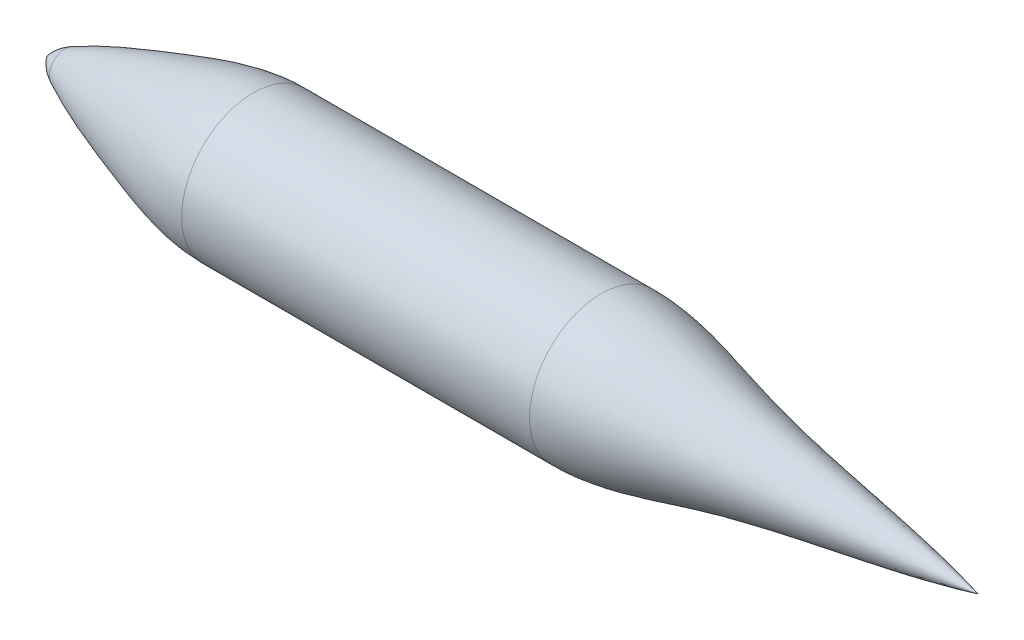
ISO-10303-21;
HEADER;
FILE_DESCRIPTION(('STEP AP214'),'2;1');
FILE_NAME('part.step','',(''),(''),'','','');
FILE_SCHEMA(('AUTOMOTIVE_DESIGN { 1 0 10303 214 1 1 1 1 }'));
ENDSEC;
DATA;
#1=APPLICATION_CONTEXT('core data for automotive mechanical design processes');
#2=APPLICATION_PROTOCOL_DEFINITION('international standard','automotive_design',2000,#1);
#3=PRODUCT_CONTEXT('',#1,'mechanical');
#4=PRODUCT('Part','Part','',(#3));
#5=PRODUCT_RELATED_PRODUCT_CATEGORY('part','',(#4));
#6=PRODUCT_DEFINITION_FORMATION('','',#4);
#7=PRODUCT_DEFINITION_CONTEXT('part definition',#1,'design');
#8=PRODUCT_DEFINITION('design','',#6,#7);
#9=PRODUCT_DEFINITION_SHAPE('','',#8);
#10=(LENGTH_UNIT() NAMED_UNIT(*) SI_UNIT(.MILLI.,.METRE.));
#11=(NAMED_UNIT(*) PLANE_ANGLE_UNIT() SI_UNIT($,.RADIAN.));
#12=(NAMED_UNIT(*) SI_UNIT($,.STERADIAN.) SOLID_ANGLE_UNIT());
#13=UNCERTAINTY_MEASURE_WITH_UNIT(LENGTH_MEASURE(1.E-05),#10,'distance_accuracy_value','');
#14=(GEOMETRIC_REPRESENTATION_CONTEXT(3) GLOBAL_UNCERTAINTY_ASSIGNED_CONTEXT((#13)) GLOBAL_UNIT_ASSIGNED_CONTEXT((#10,
#11,#12)) REPRESENTATION_CONTEXT('',''));
#15=CARTESIAN_POINT('',(0.,0.,0.));
#16=DIRECTION('',(0.,0.,1.));
#17=DIRECTION('',(1.,0.,0.));
#18=AXIS2_PLACEMENT_3D('',#15,#16,#17);
#19=CARTESIAN_POINT('',(-173.8,0.,33.1));
#20=CARTESIAN_POINT('',(-154.274057960004,0.,33.1));
#21=CARTESIAN_POINT('',(-123.601815915925,0.,23.1981520955853));
#22=CARTESIAN_POINT('',(-65.5245143266319,0.,11.9058907758357));
#23=CARTESIAN_POINT('',(-25.1896816177886,0.,6.42069034833408));
#24=CARTESIAN_POINT('',(0.,0.,0.));
#25=B_SPLINE_CURVE_WITH_KNOTS('',3,(#19,#20,#21,#22,#23,#24),.UNSPECIFIED.,.F.,.F.,(4,1,1,4),
(0.,0.305180337866786,0.55947683465441,1.),.UNSPECIFIED.);
#26=CARTESIAN_POINT('',(0.,0.,0.));
#27=DIRECTION('',(1.,0.,0.));
#28=AXIS1_PLACEMENT('',#26,#27);
#29=SURFACE_OF_REVOLUTION('',#25,#28);
#30=CARTESIAN_POINT('',(0.,0.,0.));
#31=VERTEX_POINT('',#30);
#32=VERTEX_LOOP('',#31);
#33=FACE_BOUND('',#32,.T.);
#34=CARTESIAN_POINT('',(-173.8,0.,0.));
#35=DIRECTION('',(1.,0.,0.));
#36=DIRECTION('',(0.,0.,-1.));
#37=AXIS2_PLACEMENT_3D('',#34,#35,#36);
#38=CIRCLE('',#37,33.1);
#39=CARTESIAN_POINT('',(-173.8,0.,-33.1));
#40=VERTEX_POINT('',#39);
#41=EDGE_CURVE('E63',#40,#40,#38,.T.);
#42=ORIENTED_EDGE('',*,*,#41,.T.);
#43=EDGE_LOOP('',(#42));
#44=FACE_BOUND('',#43,.T.);
#45=ADVANCED_FACE('F44',(#33,#44),#29,.T.);
#46=CARTESIAN_POINT('',(-429.484249418414,0.,0.));
#47=CARTESIAN_POINT('',(-427.346807948341,0.,3.1231572205502));
#48=CARTESIAN_POINT('',(-424.585391475536,0.,5.53649055388354));
#49=CARTESIAN_POINT('',(-421.2,0.,7.24));
#50=B_SPLINE_CURVE_WITH_KNOTS('',3,(#46,#47,#48,#49),.UNSPECIFIED.,.F.,.F.,(4,4),(0.,1.),.UNSPECIFIED.);
#51=CARTESIAN_POINT('',(0.,0.,0.));
#52=DIRECTION('',(1.,0.,0.));
#53=AXIS1_PLACEMENT('',#51,#52);
#54=SURFACE_OF_REVOLUTION('',#50,#53);
#55=CARTESIAN_POINT('',(-421.2,0.,0.));
#56=DIRECTION('',(1.,0.,0.));
#57=DIRECTION('',(0.,0.,-1.));
#58=AXIS2_PLACEMENT_3D('',#55,#56,#57);
#59=CIRCLE('',#58,7.24);
#60=CARTESIAN_POINT('',(-421.2,0.,-7.24));
#61=VERTEX_POINT('',#60);
#62=EDGE_CURVE('E11',#61,#61,#59,.T.);
#63=ORIENTED_EDGE('',*,*,#62,.F.);
#64=EDGE_LOOP('',(#63));
#65=FACE_BOUND('',#64,.T.);
#66=CARTESIAN_POINT('',(-429.484249418414,0.,0.));
#67=VERTEX_POINT('',#66);
#68=VERTEX_LOOP('',#67);
#69=FACE_BOUND('',#68,.T.);
#70=ADVANCED_FACE('F65',(#65,#69),#54,.T.);
#71=CARTESIAN_POINT('',(-421.2,0.,7.24));
#72=CARTESIAN_POINT('',(-407.741660776949,0.,14.0121586000253));
#73=CARTESIAN_POINT('',(-379.219747339394,0.,23.4523134447075));
#74=CARTESIAN_POINT('',(-349.712171145906,0.,33.1));
#75=CARTESIAN_POINT('',(-334.3,0.,33.1));
#76=B_SPLINE_CURVE_WITH_KNOTS('',3,(#71,#72,#73,#74,#75),.UNSPECIFIED.,.F.,.F.,(4,1,4),(0.,
0.49265502317334,1.),.UNSPECIFIED.);
#77=CARTESIAN_POINT('',(0.,0.,0.));
#78=DIRECTION('',(1.,0.,0.));
#79=AXIS1_PLACEMENT('',#77,#78);
#80=SURFACE_OF_REVOLUTION('',#76,#79);
#81=CARTESIAN_POINT('',(-334.3,0.,0.));
#82=DIRECTION('',(1.,0.,0.));
#83=DIRECTION('',(0.,0.,-1.));
#84=AXIS2_PLACEMENT_3D('',#81,#82,#83);
#85=CIRCLE('',#84,33.1);
#86=CARTESIAN_POINT('',(-334.3,0.,-33.1));
#87=VERTEX_POINT('',#86);
#88=EDGE_CURVE('E53',#87,#87,#85,.T.);
#89=ORIENTED_EDGE('',*,*,#88,.F.);
#90=EDGE_LOOP('',(#89));
#91=FACE_BOUND('',#90,.T.);
#92=ORIENTED_EDGE('',*,*,#62,.T.);
#93=EDGE_LOOP('',(#92));
#94=FACE_BOUND('',#93,.T.);
#95=ADVANCED_FACE('F83',(#91,#94),#80,.T.);
#96=CARTESIAN_POINT('',(0.,0.,0.));
#97=DIRECTION('',(1.,0.,0.));
#98=DIRECTION('',(0.,0.,-1.));
#99=AXIS2_PLACEMENT_3D('',#96,#97,#98);
#100=CYLINDRICAL_SURFACE('',#99,33.1);
#101=ORIENTED_EDGE('',*,*,#41,.F.);
#102=EDGE_LOOP('',(#101));
#103=FACE_BOUND('',#102,.T.);
#104=ORIENTED_EDGE('',*,*,#88,.T.);
#105=EDGE_LOOP('',(#104));
#106=FACE_BOUND('',#105,.T.);
#107=ADVANCED_FACE('F88',(#103,#106),#100,.T.);
#108=CLOSED_SHELL('',(#45,#70,#95,#107));
#109=MANIFOLD_SOLID_BREP('B2',#108);
#110=ADVANCED_BREP_SHAPE_REPRESENTATION('',(#18,#109),#14);
#111=SHAPE_DEFINITION_REPRESENTATION(#9,#110);
ENDSEC;
END-ISO-10303-21;
